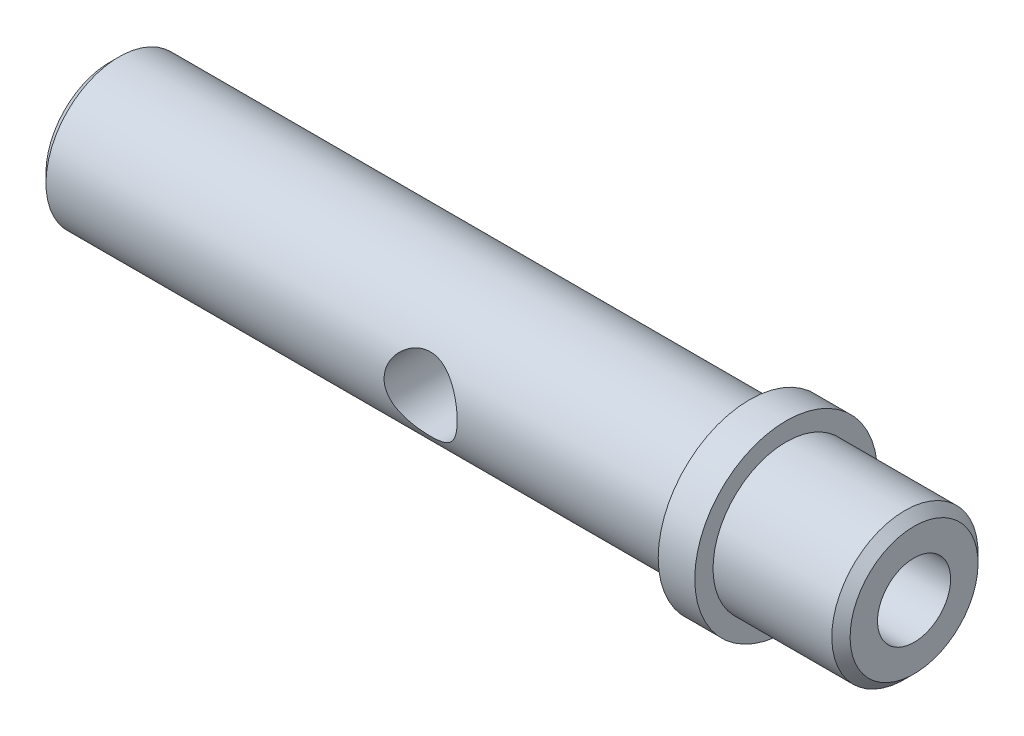
ISO-10303-21;
HEADER;
FILE_DESCRIPTION(('STEP AP214'),'2;1');
FILE_NAME('part.step','',(''),(''),'','','');
FILE_SCHEMA(('AUTOMOTIVE_DESIGN { 1 0 10303 214 1 1 1 1 }'));
ENDSEC;
DATA;
#1=APPLICATION_CONTEXT('core data for automotive mechanical design processes');
#2=APPLICATION_PROTOCOL_DEFINITION('international standard','automotive_design',2000,#1);
#3=PRODUCT_CONTEXT('',#1,'mechanical');
#4=PRODUCT('Part','Part','',(#3));
#5=PRODUCT_RELATED_PRODUCT_CATEGORY('part','',(#4));
#6=PRODUCT_DEFINITION_FORMATION('','',#4);
#7=PRODUCT_DEFINITION_CONTEXT('part definition',#1,'design');
#8=PRODUCT_DEFINITION('design','',#6,#7);
#9=PRODUCT_DEFINITION_SHAPE('','',#8);
#10=(LENGTH_UNIT() NAMED_UNIT(*) SI_UNIT(.MILLI.,.METRE.));
#11=(NAMED_UNIT(*) PLANE_ANGLE_UNIT() SI_UNIT($,.RADIAN.));
#12=(NAMED_UNIT(*) SI_UNIT($,.STERADIAN.) SOLID_ANGLE_UNIT());
#13=UNCERTAINTY_MEASURE_WITH_UNIT(LENGTH_MEASURE(1.E-05),#10,'distance_accuracy_value','');
#14=(GEOMETRIC_REPRESENTATION_CONTEXT(3) GLOBAL_UNCERTAINTY_ASSIGNED_CONTEXT((#13)) GLOBAL_UNIT_ASSIGNED_CONTEXT((#10,
#11,#12)) REPRESENTATION_CONTEXT('',''));
#15=CARTESIAN_POINT('',(0.,0.,0.));
#16=DIRECTION('',(0.,0.,1.));
#17=DIRECTION('',(1.,0.,0.));
#18=AXIS2_PLACEMENT_3D('',#15,#16,#17);
#19=CARTESIAN_POINT('',(-16.7017543859649,0.,0.));
#20=DIRECTION('',(-1.,0.,0.));
#21=DIRECTION('',(0.,-1.,0.));
#22=AXIS2_PLACEMENT_3D('',#19,#20,#21);
#23=CYLINDRICAL_SURFACE('',#22,2.);
#24=CARTESIAN_POINT('',(0.250000000000007,0.,0.));
#25=DIRECTION('',(-1.,0.,0.));
#26=DIRECTION('',(0.,-1.,0.));
#27=AXIS2_PLACEMENT_3D('',#24,#25,#26);
#28=CIRCLE('',#27,2.);
#29=CARTESIAN_POINT('',(0.250000000000007,-2.,0.));
#30=VERTEX_POINT('',#29);
#31=EDGE_CURVE('E12',#30,#30,#28,.F.);
#32=ORIENTED_EDGE('',*,*,#31,.T.);
#33=EDGE_LOOP('',(#32));
#34=FACE_BOUND('',#33,.T.);
#35=CARTESIAN_POINT('',(11.5,0.,-2.));
#36=CARTESIAN_POINT('',(11.4999966976805,-0.0525719629529866,-1.99999713404151));
#37=CARTESIAN_POINT('',(11.4958299268783,-0.105206599698033,-1.99790491019518));
#38=CARTESIAN_POINT('',(11.4793471196591,-0.208920235268425,-1.98974156037396));
#39=CARTESIAN_POINT('',(11.4670156070024,-0.259996086713504,-1.98366287828984));
#40=CARTESIAN_POINT('',(11.4348061913832,-0.358933544880574,-1.96816279403312));
#41=CARTESIAN_POINT('',(11.414957615752,-0.40680680293918,-1.9587543917752));
#42=CARTESIAN_POINT('',(11.3684293786351,-0.498472616806565,-1.93745776515779));
#43=CARTESIAN_POINT('',(11.3417502557511,-0.54226549399005,-1.9255697363353));
#44=CARTESIAN_POINT('',(11.2804827505147,-0.62750781776192,-1.89956258258057));
#45=CARTESIAN_POINT('',(11.2455135207604,-0.668655211122113,-1.88535199127536));
#46=CARTESIAN_POINT('',(11.169478520753,-0.744779444866978,-1.85659970246744));
#47=CARTESIAN_POINT('',(11.1284081482276,-0.779751583106767,-1.84205776209035));
#48=CARTESIAN_POINT('',(11.0375166504766,-0.845252000450279,-1.81298951197347));
#49=CARTESIAN_POINT('',(10.9872639016541,-0.875225335551638,-1.79855186970132));
#50=CARTESIAN_POINT('',(10.8816326640138,-0.926168226890696,-1.77285978772321));
#51=CARTESIAN_POINT('',(10.8262578712773,-0.947144214966335,-1.7616030760699));
#52=CARTESIAN_POINT('',(10.7153348945781,-0.97813244218859,-1.74457867037808));
#53=CARTESIAN_POINT('',(10.6599955479326,-0.988725857080443,-1.73852271583714));
#54=CARTESIAN_POINT('',(10.5480211622205,-1.00042699330885,-1.73181889948528));
#55=CARTESIAN_POINT('',(10.4913874591288,-1.00154408837308,-1.73116569343288));
#56=CARTESIAN_POINT('',(10.3857139756846,-0.994687287172296,-1.73510930257248));
#57=CARTESIAN_POINT('',(10.3365759687769,-0.987784559536823,-1.73908763662014));
#58=CARTESIAN_POINT('',(10.240278090627,-0.966939849056934,-1.7507622873385));
#59=CARTESIAN_POINT('',(10.1931188546947,-0.952995623897653,-1.75845978831776));
#60=CARTESIAN_POINT('',(10.1007708674343,-0.918209780386005,-1.77687476412741));
#61=CARTESIAN_POINT('',(10.0556536012142,-0.897215067115996,-1.78765840663998));
#62=CARTESIAN_POINT('',(9.96936570740999,-0.849041687668004,-1.81103404281404));
#63=CARTESIAN_POINT('',(9.92819686439991,-0.821860243812469,-1.82362684780191));
#64=CARTESIAN_POINT('',(9.84547874725677,-0.75806605491279,-1.85113157903286));
#65=CARTESIAN_POINT('',(9.80454312642384,-0.720694458369283,-1.86613510236746));
#66=CARTESIAN_POINT('',(9.7292645814091,-0.639555578741375,-1.89547623300407));
#67=CARTESIAN_POINT('',(9.69492480796611,-0.595785256574287,-1.90981351958801));
#68=CARTESIAN_POINT('',(9.63231433897027,-0.50051650583185,-1.93701987282964));
#69=CARTESIAN_POINT('',(9.60439952755426,-0.44875359159941,-1.94978984162007));
#70=CARTESIAN_POINT('',(9.55790297095699,-0.340466215488798,-1.97157881121242));
#71=CARTESIAN_POINT('',(9.53931381498483,-0.283945576265278,-1.98060078943553));
#72=CARTESIAN_POINT('',(9.51352459628332,-0.172766491660703,-1.99324333741436));
#73=CARTESIAN_POINT('',(9.50550876425322,-0.118341530548326,-1.99724938301312));
#74=CARTESIAN_POINT('',(9.49853526886551,-0.008779599949355,-2.00073013459102));
#75=CARTESIAN_POINT('',(9.49957331436052,0.0463570198699002,-2.00020698721312));
#76=CARTESIAN_POINT('',(9.51020668841875,0.151232971985993,-1.99491192253441));
#77=CARTESIAN_POINT('',(9.51913253273003,0.201059408049953,-1.9904724568819));
#78=CARTESIAN_POINT('',(9.54423807189508,0.298406892301916,-1.97822171314819));
#79=CARTESIAN_POINT('',(9.56041856645336,0.345927685690996,-1.97041006334333));
#80=CARTESIAN_POINT('',(9.59999846643317,0.438888608449665,-1.9518425141367));
#81=CARTESIAN_POINT('',(9.62359105011681,0.484230397006154,-1.94100881769939));
#82=CARTESIAN_POINT('',(9.67710753564604,0.570461361698921,-1.91743974317109));
#83=CARTESIAN_POINT('',(9.70703413459343,0.611348629775282,-1.90470355565785));
#84=CARTESIAN_POINT('',(9.77576042533287,0.691767689290654,-1.87708221337464));
#85=CARTESIAN_POINT('',(9.81514286845356,0.730772077824639,-1.86210884848441));
#86=CARTESIAN_POINT('',(9.8999251512693,0.80185632111324,-1.83262391603874));
#87=CARTESIAN_POINT('',(9.94532911881637,0.833931385690841,-1.81811267381526));
#88=CARTESIAN_POINT('',(10.0436436542003,0.891707914497696,-1.79051192226068));
#89=CARTESIAN_POINT('',(10.0968112662086,0.917025495878638,-1.77752529663472));
#90=CARTESIAN_POINT('',(10.2075100676925,0.958082826013804,-1.75574072368126));
#91=CARTESIAN_POINT('',(10.2650355265012,0.973834915887571,-1.74693738240618));
#92=CARTESIAN_POINT('',(10.3769102228614,0.993861687449681,-1.73561501008667));
#93=CARTESIAN_POINT('',(10.431034253429,0.999092996400866,-1.73257383460491));
#94=CARTESIAN_POINT('',(10.5394470671707,1.00068915438079,-1.73165354646175));
#95=CARTESIAN_POINT('',(10.5937357687394,0.9970578466244,-1.73377219627553));
#96=CARTESIAN_POINT('',(10.695483501532,0.981926125592265,-1.74237862050025));
#97=CARTESIAN_POINT('',(10.7431004701444,0.971208314342801,-1.74843094482394));
#98=CARTESIAN_POINT('',(10.8358081194247,0.943175358224647,-1.76371016187917));
#99=CARTESIAN_POINT('',(10.880897982092,0.925858091159813,-1.77293807569675));
#100=CARTESIAN_POINT('',(10.9706248509866,0.883815745300685,-1.79428530364528));
#101=CARTESIAN_POINT('',(11.0150279018297,0.85867113781646,-1.80655722396191));
#102=CARTESIAN_POINT('',(11.0992745361806,0.802150971636636,-1.8323533163459));
#103=CARTESIAN_POINT('',(11.1391157305185,0.77077217123865,-1.84587813794522));
#104=CARTESIAN_POINT('',(11.2181419823576,0.698203326664643,-1.87462323159313));
#105=CARTESIAN_POINT('',(11.2566591023619,0.656284423010173,-1.88984983311469));
#106=CARTESIAN_POINT('',(11.3262629834236,0.566154806220281,-1.91877752255088));
#107=CARTESIAN_POINT('',(11.3573457394263,0.517940723256786,-1.9324777860804));
#108=CARTESIAN_POINT('',(11.4112363627622,0.415931596819948,-1.95698009585103));
#109=CARTESIAN_POINT('',(11.4339841694114,0.362099503934616,-1.96776096562909));
#110=CARTESIAN_POINT('',(11.469808167919,0.250742101294193,-1.98501341363465));
#111=CARTESIAN_POINT('',(11.4829118468296,0.193227799623168,-1.99149723372932));
#112=CARTESIAN_POINT('',(11.4938974110758,0.112601946483385,-1.99695461909663));
#113=CARTESIAN_POINT('',(11.4961826408636,0.0901618794395,-1.99809365339202));
#114=CARTESIAN_POINT('',(11.4992346655168,0.0451517318071585,-1.99961696977865));
#115=CARTESIAN_POINT('',(11.5000014184712,0.0225816476473818,-2.00000123103763));
#116=CARTESIAN_POINT('',(11.5,0.,-2.));
#117=B_SPLINE_CURVE_WITH_KNOTS('',3,(#35,#36,#37,#38,#39,#40,#41,#42,#43,#44,#45,#46,#47,#48,
#49,#50,#51,#52,#53,#54,#55,#56,#57,#58,#59,#60,#61,#62,#63,#64,#65,#66,#67,#68,#69,#70,#71,#72,
#73,#74,#75,#76,#77,#78,#79,#80,#81,#82,#83,#84,#85,#86,#87,#88,#89,#90,#91,#92,#93,#94,#95,#96,
#97,#98,#99,#100,#101,#102,#103,#104,#105,#106,#107,#108,#109,#110,#111,#112,#113,#114,#115,
#116),.UNSPECIFIED.,.T.,.F.,(4,2,2,2,2,2,2,2,2,2,2,2,2,2,2,2,2,2,2,2,2,2,2,2,2,2,2,2,2,2,2,2,2,
2,2,2,2,2,2,2,4),(0.,0.157624257420293,0.315548149709198,0.472862155492298,0.630163760581568,
0.79698175871809,0.963926237654036,1.14381726430753,1.32357947898281,1.4925801214023,
1.66141357329021,1.81005712409321,1.95874803925679,2.11090240168488,2.26312521260222,
2.43464941333879,2.60625534598687,2.78583022214441,2.9652621691228,3.12983290471346,
3.29432564511476,3.44606906506122,3.59782921630932,3.75392856027899,3.9100945074834,
4.08159610644419,4.25321588615432,4.43314682159675,4.61284511940778,4.77529307498374,
4.93767059860006,5.08457930244183,5.23153528783679,5.38836456775615,5.54527561138959,
5.72125242752499,5.89732383376574,6.07464013662926,6.25144908624931,6.31915280137699,
6.38685838514848),.UNSPECIFIED.);
#118=CARTESIAN_POINT('',(11.5,0.,-2.));
#119=VERTEX_POINT('',#118);
#120=EDGE_CURVE('E85',#119,#119,#117,.T.);
#121=ORIENTED_EDGE('',*,*,#120,.F.);
#122=EDGE_LOOP('',(#121));
#123=FACE_BOUND('',#122,.T.);
#124=CARTESIAN_POINT('',(11.5,0.,2.));
#125=CARTESIAN_POINT('',(11.4999966976805,0.0525719629529866,1.99999713404151));
#126=CARTESIAN_POINT('',(11.4958299268783,0.105206599698033,1.99790491019518));
#127=CARTESIAN_POINT('',(11.4793471196591,0.208920235268425,1.98974156037396));
#128=CARTESIAN_POINT('',(11.4670156070024,0.259996086713504,1.98366287828984));
#129=CARTESIAN_POINT('',(11.4348061913832,0.358933544880574,1.96816279403312));
#130=CARTESIAN_POINT('',(11.414957615752,0.40680680293918,1.9587543917752));
#131=CARTESIAN_POINT('',(11.3684293786351,0.498472616806565,1.93745776515779));
#132=CARTESIAN_POINT('',(11.3417502557511,0.54226549399005,1.9255697363353));
#133=CARTESIAN_POINT('',(11.2804827505147,0.62750781776192,1.89956258258057));
#134=CARTESIAN_POINT('',(11.2455135207604,0.668655211122113,1.88535199127536));
#135=CARTESIAN_POINT('',(11.169478520753,0.744779444866978,1.85659970246744));
#136=CARTESIAN_POINT('',(11.1284081482276,0.779751583106767,1.84205776209035));
#137=CARTESIAN_POINT('',(11.0375166504766,0.845252000450279,1.81298951197347));
#138=CARTESIAN_POINT('',(10.9872639016541,0.875225335551638,1.79855186970132));
#139=CARTESIAN_POINT('',(10.8816326640138,0.926168226890696,1.77285978772321));
#140=CARTESIAN_POINT('',(10.8262578712773,0.947144214966335,1.7616030760699));
#141=CARTESIAN_POINT('',(10.7153348945781,0.97813244218859,1.74457867037808));
#142=CARTESIAN_POINT('',(10.6599955479326,0.988725857080443,1.73852271583714));
#143=CARTESIAN_POINT('',(10.5480211622205,1.00042699330885,1.73181889948528));
#144=CARTESIAN_POINT('',(10.4913874591288,1.00154408837308,1.73116569343288));
#145=CARTESIAN_POINT('',(10.3857139756846,0.994687287172296,1.73510930257248));
#146=CARTESIAN_POINT('',(10.3365759687769,0.987784559536823,1.73908763662014));
#147=CARTESIAN_POINT('',(10.240278090627,0.966939849056934,1.7507622873385));
#148=CARTESIAN_POINT('',(10.1931188546947,0.952995623897653,1.75845978831776));
#149=CARTESIAN_POINT('',(10.1007708674343,0.918209780386005,1.77687476412741));
#150=CARTESIAN_POINT('',(10.0556536012142,0.897215067115996,1.78765840663998));
#151=CARTESIAN_POINT('',(9.96936570740999,0.849041687668004,1.81103404281404));
#152=CARTESIAN_POINT('',(9.92819686439991,0.821860243812469,1.82362684780191));
#153=CARTESIAN_POINT('',(9.84547874725677,0.75806605491279,1.85113157903286));
#154=CARTESIAN_POINT('',(9.80454312642384,0.720694458369283,1.86613510236746));
#155=CARTESIAN_POINT('',(9.7292645814091,0.639555578741375,1.89547623300407));
#156=CARTESIAN_POINT('',(9.69492480796611,0.595785256574287,1.90981351958801));
#157=CARTESIAN_POINT('',(9.63231433897027,0.50051650583185,1.93701987282964));
#158=CARTESIAN_POINT('',(9.60439952755426,0.44875359159941,1.94978984162007));
#159=CARTESIAN_POINT('',(9.55790297095699,0.340466215488798,1.97157881121242));
#160=CARTESIAN_POINT('',(9.53931381498483,0.283945576265278,1.98060078943553));
#161=CARTESIAN_POINT('',(9.51352459628332,0.172766491660703,1.99324333741436));
#162=CARTESIAN_POINT('',(9.50550876425322,0.118341530548326,1.99724938301312));
#163=CARTESIAN_POINT('',(9.49853526886551,0.008779599949355,2.00073013459102));
#164=CARTESIAN_POINT('',(9.49957331436052,-0.0463570198699002,2.00020698721312));
#165=CARTESIAN_POINT('',(9.51020668841875,-0.151232971985993,1.99491192253441));
#166=CARTESIAN_POINT('',(9.51913253273003,-0.201059408049953,1.9904724568819));
#167=CARTESIAN_POINT('',(9.54423807189508,-0.298406892301916,1.97822171314819));
#168=CARTESIAN_POINT('',(9.56041856645336,-0.345927685690996,1.97041006334333));
#169=CARTESIAN_POINT('',(9.59999846643317,-0.438888608449665,1.9518425141367));
#170=CARTESIAN_POINT('',(9.62359105011681,-0.484230397006154,1.94100881769939));
#171=CARTESIAN_POINT('',(9.67710753564604,-0.570461361698921,1.91743974317109));
#172=CARTESIAN_POINT('',(9.70703413459343,-0.611348629775282,1.90470355565785));
#173=CARTESIAN_POINT('',(9.77576042533287,-0.691767689290654,1.87708221337464));
#174=CARTESIAN_POINT('',(9.81514286845356,-0.730772077824639,1.86210884848441));
#175=CARTESIAN_POINT('',(9.8999251512693,-0.80185632111324,1.83262391603874));
#176=CARTESIAN_POINT('',(9.94532911881637,-0.833931385690841,1.81811267381526));
#177=CARTESIAN_POINT('',(10.0436436542003,-0.891707914497696,1.79051192226068));
#178=CARTESIAN_POINT('',(10.0968112662086,-0.917025495878638,1.77752529663472));
#179=CARTESIAN_POINT('',(10.2075100676925,-0.958082826013804,1.75574072368126));
#180=CARTESIAN_POINT('',(10.2650355265012,-0.973834915887571,1.74693738240618));
#181=CARTESIAN_POINT('',(10.3769102228614,-0.993861687449681,1.73561501008667));
#182=CARTESIAN_POINT('',(10.431034253429,-0.999092996400866,1.73257383460491));
#183=CARTESIAN_POINT('',(10.5394470671707,-1.00068915438079,1.73165354646175));
#184=CARTESIAN_POINT('',(10.5937357687394,-0.9970578466244,1.73377219627553));
#185=CARTESIAN_POINT('',(10.695483501532,-0.981926125592265,1.74237862050025));
#186=CARTESIAN_POINT('',(10.7431004701444,-0.971208314342801,1.74843094482394));
#187=CARTESIAN_POINT('',(10.8358081194247,-0.943175358224647,1.76371016187917));
#188=CARTESIAN_POINT('',(10.880897982092,-0.925858091159813,1.77293807569675));
#189=CARTESIAN_POINT('',(10.9706248509866,-0.883815745300685,1.79428530364528));
#190=CARTESIAN_POINT('',(11.0150279018297,-0.85867113781646,1.80655722396191));
#191=CARTESIAN_POINT('',(11.0992745361806,-0.802150971636636,1.8323533163459));
#192=CARTESIAN_POINT('',(11.1391157305185,-0.77077217123865,1.84587813794522));
#193=CARTESIAN_POINT('',(11.2181419823576,-0.698203326664643,1.87462323159313));
#194=CARTESIAN_POINT('',(11.2566591023619,-0.656284423010173,1.88984983311469));
#195=CARTESIAN_POINT('',(11.3262629834236,-0.566154806220281,1.91877752255088));
#196=CARTESIAN_POINT('',(11.3573457394263,-0.517940723256786,1.9324777860804));
#197=CARTESIAN_POINT('',(11.4112363627622,-0.415931596819948,1.95698009585103));
#198=CARTESIAN_POINT('',(11.4339841694114,-0.362099503934616,1.96776096562909));
#199=CARTESIAN_POINT('',(11.469808167919,-0.250742101294193,1.98501341363465));
#200=CARTESIAN_POINT('',(11.4829118468296,-0.193227799623168,1.99149723372932));
#201=CARTESIAN_POINT('',(11.4938974110758,-0.112601946483385,1.99695461909663));
#202=CARTESIAN_POINT('',(11.4961826408636,-0.0901618794395,1.99809365339202));
#203=CARTESIAN_POINT('',(11.4992346655168,-0.0451517318071585,1.99961696977865));
#204=CARTESIAN_POINT('',(11.5000014184712,-0.0225816476473818,2.00000123103763));
#205=CARTESIAN_POINT('',(11.5,0.,2.));
#206=B_SPLINE_CURVE_WITH_KNOTS('',3,(#124,#125,#126,#127,#128,#129,#130,#131,#132,#133,#134,
#135,#136,#137,#138,#139,#140,#141,#142,#143,#144,#145,#146,#147,#148,#149,#150,#151,#152,#153,
#154,#155,#156,#157,#158,#159,#160,#161,#162,#163,#164,#165,#166,#167,#168,#169,#170,#171,#172,
#173,#174,#175,#176,#177,#178,#179,#180,#181,#182,#183,#184,#185,#186,#187,#188,#189,#190,#191,
#192,#193,#194,#195,#196,#197,#198,#199,#200,#201,#202,#203,#204,#205),.UNSPECIFIED.,.T.,.F.,(4,
2,2,2,2,2,2,2,2,2,2,2,2,2,2,2,2,2,2,2,2,2,2,2,2,2,2,2,2,2,2,2,2,2,2,2,2,2,2,2,4),(0.,
0.157624257420293,0.315548149709198,0.472862155492298,0.630163760581568,0.79698175871809,
0.963926237654036,1.14381726430753,1.32357947898281,1.4925801214023,1.66141357329021,
1.81005712409321,1.95874803925679,2.11090240168488,2.26312521260222,2.43464941333879,
2.60625534598687,2.78583022214441,2.9652621691228,3.12983290471346,3.29432564511476,
3.44606906506122,3.59782921630932,3.75392856027899,3.9100945074834,4.08159610644419,
4.25321588615432,4.43314682159675,4.61284511940778,4.77529307498374,4.93767059860006,
5.08457930244183,5.23153528783679,5.38836456775615,5.54527561138959,5.72125242752499,
5.89732383376574,6.07464013662926,6.25144908624931,6.31915280137699,6.38685838514848),.UNSPECIFIED.);
#207=CARTESIAN_POINT('',(11.5,0.,2.));
#208=VERTEX_POINT('',#207);
#209=EDGE_CURVE('E94',#208,#208,#206,.T.);
#210=ORIENTED_EDGE('',*,*,#209,.F.);
#211=EDGE_LOOP('',(#210));
#212=FACE_BOUND('',#211,.T.);
#213=CARTESIAN_POINT('',(17.5,0.,0.));
#214=DIRECTION('',(1.,0.,0.));
#215=DIRECTION('',(0.,1.,0.));
#216=AXIS2_PLACEMENT_3D('',#213,#214,#215);
#217=CIRCLE('',#216,2.);
#218=CARTESIAN_POINT('',(17.5,2.,0.));
#219=VERTEX_POINT('',#218);
#220=EDGE_CURVE('E147',#219,#219,#217,.T.);
#221=ORIENTED_EDGE('',*,*,#220,.F.);
#222=EDGE_LOOP('',(#221));
#223=FACE_BOUND('',#222,.T.);
#224=ADVANCED_FACE('F56',(#34,#123,#212,#223),#23,.T.);
#225=CARTESIAN_POINT('',(0.,0.,0.));
#226=DIRECTION('',(-1.,0.,0.));
#227=DIRECTION('',(0.,-1.,0.));
#228=AXIS2_PLACEMENT_3D('',#225,#226,#227);
#229=PLANE('',#228);
#230=CARTESIAN_POINT('',(0.,0.,0.));
#231=DIRECTION('',(-1.,0.,0.));
#232=DIRECTION('',(0.,-1.,0.));
#233=AXIS2_PLACEMENT_3D('',#230,#231,#232);
#234=CIRCLE('',#233,1.74999999999999);
#235=CARTESIAN_POINT('',(0.,-1.74999999999999,0.));
#236=VERTEX_POINT('',#235);
#237=EDGE_CURVE('E65',#236,#236,#234,.T.);
#238=ORIENTED_EDGE('',*,*,#237,.T.);
#239=EDGE_LOOP('',(#238));
#240=FACE_BOUND('',#239,.T.);
#241=ADVANCED_FACE('F107',(#240),#229,.T.);
#242=CARTESIAN_POINT('',(10.5,0.,-5.));
#243=DIRECTION('',(0.,0.,1.));
#244=DIRECTION('',(1.,0.,0.));
#245=AXIS2_PLACEMENT_3D('',#242,#243,#244);
#246=CYLINDRICAL_SURFACE('',#245,1.);
#247=ORIENTED_EDGE('',*,*,#120,.T.);
#248=EDGE_LOOP('',(#247));
#249=FACE_BOUND('',#248,.T.);
#250=ORIENTED_EDGE('',*,*,#209,.T.);
#251=EDGE_LOOP('',(#250));
#252=FACE_BOUND('',#251,.T.);
#253=ADVANCED_FACE('F102',(#249,#252),#246,.F.);
#254=CARTESIAN_POINT('',(17.5,0.,0.));
#255=DIRECTION('',(1.,0.,0.));
#256=DIRECTION('',(0.,1.,0.));
#257=AXIS2_PLACEMENT_3D('',#254,#255,#256);
#258=CYLINDRICAL_SURFACE('',#257,2.5);
#259=CARTESIAN_POINT('',(17.5,0.,0.));
#260=DIRECTION('',(1.,0.,0.));
#261=DIRECTION('',(0.,1.,0.));
#262=AXIS2_PLACEMENT_3D('',#259,#260,#261);
#263=CIRCLE('',#262,2.5);
#264=CARTESIAN_POINT('',(17.5,2.5,0.));
#265=VERTEX_POINT('',#264);
#266=EDGE_CURVE('E146',#265,#265,#263,.T.);
#267=ORIENTED_EDGE('',*,*,#266,.T.);
#268=EDGE_LOOP('',(#267));
#269=FACE_BOUND('',#268,.T.);
#270=CARTESIAN_POINT('',(18.5,0.,0.));
#271=DIRECTION('',(1.,0.,0.));
#272=DIRECTION('',(0.,1.,0.));
#273=AXIS2_PLACEMENT_3D('',#270,#271,#272);
#274=CIRCLE('',#273,2.5);
#275=CARTESIAN_POINT('',(18.5,2.5,0.));
#276=VERTEX_POINT('',#275);
#277=EDGE_CURVE('E143',#276,#276,#274,.T.);
#278=ORIENTED_EDGE('',*,*,#277,.F.);
#279=EDGE_LOOP('',(#278));
#280=FACE_BOUND('',#279,.T.);
#281=ADVANCED_FACE('F106',(#269,#280),#258,.T.);
#282=CARTESIAN_POINT('',(17.5,0.,0.));
#283=DIRECTION('',(1.,0.,0.));
#284=DIRECTION('',(0.,1.,0.));
#285=AXIS2_PLACEMENT_3D('',#282,#283,#284);
#286=PLANE('',#285);
#287=ORIENTED_EDGE('',*,*,#220,.T.);
#288=EDGE_LOOP('',(#287));
#289=FACE_BOUND('',#288,.T.);
#290=ORIENTED_EDGE('',*,*,#266,.F.);
#291=EDGE_LOOP('',(#290));
#292=FACE_BOUND('',#291,.T.);
#293=ADVANCED_FACE('F139',(#289,#292),#286,.F.);
#294=CARTESIAN_POINT('',(18.5,0.,0.));
#295=DIRECTION('',(1.,0.,0.));
#296=DIRECTION('',(0.,1.,0.));
#297=AXIS2_PLACEMENT_3D('',#294,#295,#296);
#298=PLANE('',#297);
#299=CARTESIAN_POINT('',(18.5,0.,0.));
#300=DIRECTION('',(1.,0.,0.));
#301=DIRECTION('',(0.,1.,0.));
#302=AXIS2_PLACEMENT_3D('',#299,#300,#301);
#303=CIRCLE('',#302,2.);
#304=CARTESIAN_POINT('',(18.5,2.,0.));
#305=VERTEX_POINT('',#304);
#306=EDGE_CURVE('E81',#305,#305,#303,.F.);
#307=ORIENTED_EDGE('',*,*,#306,.T.);
#308=EDGE_LOOP('',(#307));
#309=FACE_BOUND('',#308,.T.);
#310=ORIENTED_EDGE('',*,*,#277,.T.);
#311=EDGE_LOOP('',(#310));
#312=FACE_BOUND('',#311,.T.);
#313=ADVANCED_FACE('F131',(#309,#312),#298,.T.);
#314=CARTESIAN_POINT('',(22.,0.,0.));
#315=DIRECTION('',(1.,0.,0.));
#316=DIRECTION('',(0.,1.,0.));
#317=AXIS2_PLACEMENT_3D('',#314,#315,#316);
#318=PLANE('',#317);
#319=CARTESIAN_POINT('',(22.,0.,0.));
#320=DIRECTION('',(1.,0.,0.));
#321=DIRECTION('',(0.,1.,0.));
#322=AXIS2_PLACEMENT_3D('',#319,#320,#321);
#323=CIRCLE('',#322,1.74999999999999);
#324=CARTESIAN_POINT('',(22.,1.74999999999999,0.));
#325=VERTEX_POINT('',#324);
#326=EDGE_CURVE('E75',#325,#325,#323,.T.);
#327=ORIENTED_EDGE('',*,*,#326,.T.);
#328=EDGE_LOOP('',(#327));
#329=FACE_BOUND('',#328,.T.);
#330=CARTESIAN_POINT('',(22.,0.,0.));
#331=DIRECTION('',(1.,0.,0.));
#332=DIRECTION('',(0.,1.,0.));
#333=AXIS2_PLACEMENT_3D('',#330,#331,#332);
#334=CIRCLE('',#333,1.);
#335=CARTESIAN_POINT('',(22.,1.,0.));
#336=VERTEX_POINT('',#335);
#337=EDGE_CURVE('E157',#336,#336,#334,.T.);
#338=ORIENTED_EDGE('',*,*,#337,.F.);
#339=EDGE_LOOP('',(#338));
#340=FACE_BOUND('',#339,.T.);
#341=ADVANCED_FACE('F109',(#329,#340),#318,.T.);
#342=CARTESIAN_POINT('',(21.75,0.,0.));
#343=DIRECTION('',(1.,0.,0.));
#344=DIRECTION('',(0.,1.,0.));
#345=AXIS2_PLACEMENT_3D('',#342,#343,#344);
#346=CIRCLE('',#345,2.);
#347=CARTESIAN_POINT('',(21.75,2.,0.));
#348=VERTEX_POINT('',#347);
#349=EDGE_CURVE('E70',#348,#348,#346,.F.);
#350=ORIENTED_EDGE('',*,*,#349,.T.);
#351=EDGE_LOOP('',(#350));
#352=FACE_BOUND('',#351,.T.);
#353=ORIENTED_EDGE('',*,*,#306,.F.);
#354=EDGE_LOOP('',(#353));
#355=FACE_BOUND('',#354,.T.);
#356=ADVANCED_FACE('F99',(#352,#355),#23,.T.);
#357=CARTESIAN_POINT('',(17.,0.,0.));
#358=DIRECTION('',(1.,0.,0.));
#359=DIRECTION('',(0.,1.,0.));
#360=AXIS2_PLACEMENT_3D('',#357,#358,#359);
#361=CYLINDRICAL_SURFACE('',#360,1.);
#362=CARTESIAN_POINT('',(17.,0.,0.));
#363=DIRECTION('',(1.,0.,0.));
#364=DIRECTION('',(0.,1.,0.));
#365=AXIS2_PLACEMENT_3D('',#362,#363,#364);
#366=CIRCLE('',#365,1.);
#367=CARTESIAN_POINT('',(17.,1.,0.));
#368=VERTEX_POINT('',#367);
#369=EDGE_CURVE('E154',#368,#368,#366,.T.);
#370=ORIENTED_EDGE('',*,*,#369,.F.);
#371=EDGE_LOOP('',(#370));
#372=FACE_BOUND('',#371,.T.);
#373=ORIENTED_EDGE('',*,*,#337,.T.);
#374=EDGE_LOOP('',(#373));
#375=FACE_BOUND('',#374,.T.);
#376=ADVANCED_FACE('F122',(#372,#375),#361,.F.);
#377=CARTESIAN_POINT('',(17.,0.,0.));
#378=DIRECTION('',(1.,0.,0.));
#379=DIRECTION('',(0.,1.,0.));
#380=AXIS2_PLACEMENT_3D('',#377,#378,#379);
#381=PLANE('',#380);
#382=ORIENTED_EDGE('',*,*,#369,.T.);
#383=EDGE_LOOP('',(#382));
#384=FACE_BOUND('',#383,.T.);
#385=ADVANCED_FACE('F128',(#384),#381,.T.);
#386=CARTESIAN_POINT('',(22.,0.,0.));
#387=DIRECTION('',(-1.,0.,0.));
#388=DIRECTION('',(0.,-1.,0.));
#389=AXIS2_PLACEMENT_3D('',#386,#387,#388);
#390=CONICAL_SURFACE('',#389,1.75,0.785398163397453);
#391=ORIENTED_EDGE('',*,*,#349,.F.);
#392=EDGE_LOOP('',(#391));
#393=FACE_BOUND('',#392,.T.);
#394=ORIENTED_EDGE('',*,*,#326,.F.);
#395=EDGE_LOOP('',(#394));
#396=FACE_BOUND('',#395,.T.);
#397=ADVANCED_FACE('F170',(#393,#396),#390,.T.);
#398=CARTESIAN_POINT('',(0.,0.,0.));
#399=DIRECTION('',(1.,0.,0.));
#400=DIRECTION('',(0.,1.,0.));
#401=AXIS2_PLACEMENT_3D('',#398,#399,#400);
#402=CONICAL_SURFACE('',#401,1.74999999999999,0.785398163397446);
#403=ORIENTED_EDGE('',*,*,#31,.F.);
#404=EDGE_LOOP('',(#403));
#405=FACE_BOUND('',#404,.T.);
#406=ORIENTED_EDGE('',*,*,#237,.F.);
#407=EDGE_LOOP('',(#406));
#408=FACE_BOUND('',#407,.T.);
#409=ADVANCED_FACE('F59',(#405,#408),#402,.T.);
#410=CLOSED_SHELL('',(#224,#241,#253,#281,#293,#313,#341,#356,#376,#385,#397,#409));
#411=MANIFOLD_SOLID_BREP('B2',#410);
#412=ADVANCED_BREP_SHAPE_REPRESENTATION('',(#18,#411),#14);
#413=SHAPE_DEFINITION_REPRESENTATION(#9,#412);
ENDSEC;
END-ISO-10303-21;
